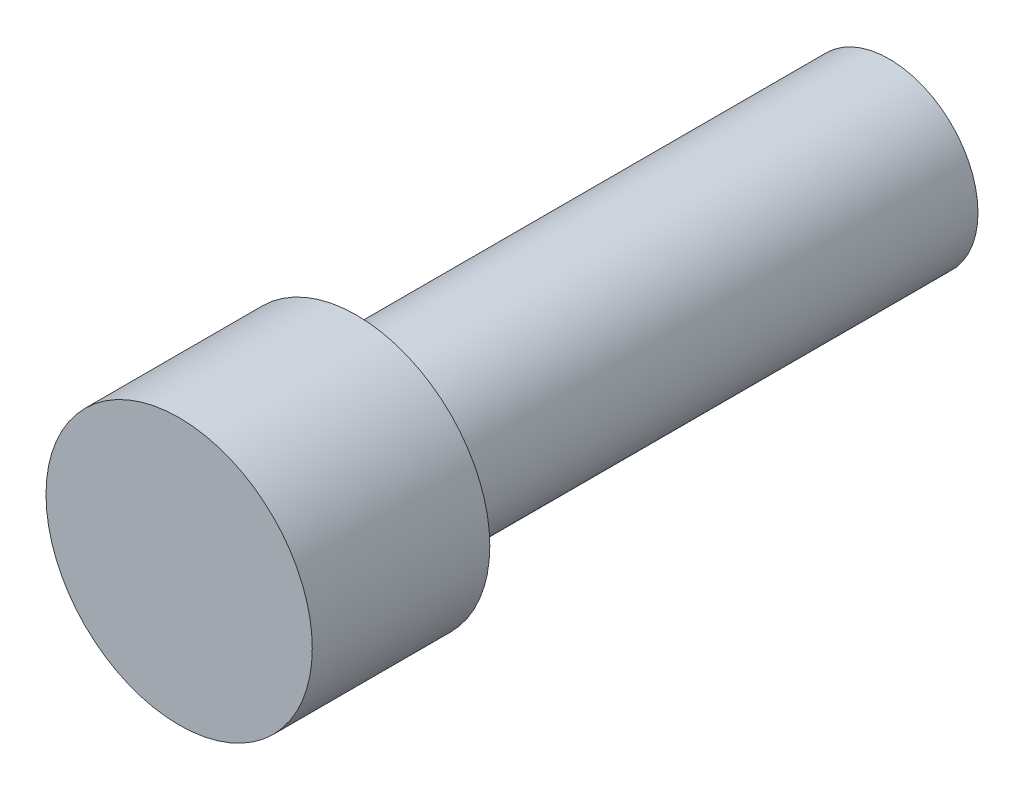
ISO-10303-21;
HEADER;
FILE_DESCRIPTION(('STEP AP214'),'2;1');
FILE_NAME('part.step','',(''),(''),'','','');
FILE_SCHEMA(('AUTOMOTIVE_DESIGN { 1 0 10303 214 1 1 1 1 }'));
ENDSEC;
DATA;
#1=APPLICATION_CONTEXT('core data for automotive mechanical design processes');
#2=APPLICATION_PROTOCOL_DEFINITION('international standard','automotive_design',2000,#1);
#3=PRODUCT_CONTEXT('',#1,'mechanical');
#4=PRODUCT('Part','Part','',(#3));
#5=PRODUCT_RELATED_PRODUCT_CATEGORY('part','',(#4));
#6=PRODUCT_DEFINITION_FORMATION('','',#4);
#7=PRODUCT_DEFINITION_CONTEXT('part definition',#1,'design');
#8=PRODUCT_DEFINITION('design','',#6,#7);
#9=PRODUCT_DEFINITION_SHAPE('','',#8);
#10=(LENGTH_UNIT() NAMED_UNIT(*) SI_UNIT(.MILLI.,.METRE.));
#11=(NAMED_UNIT(*) PLANE_ANGLE_UNIT() SI_UNIT($,.RADIAN.));
#12=(NAMED_UNIT(*) SI_UNIT($,.STERADIAN.) SOLID_ANGLE_UNIT());
#13=UNCERTAINTY_MEASURE_WITH_UNIT(LENGTH_MEASURE(1.E-05),#10,'distance_accuracy_value','');
#14=(GEOMETRIC_REPRESENTATION_CONTEXT(3) GLOBAL_UNCERTAINTY_ASSIGNED_CONTEXT((#13)) GLOBAL_UNIT_ASSIGNED_CONTEXT((#10,
#11,#12)) REPRESENTATION_CONTEXT('',''));
#15=CARTESIAN_POINT('',(0.,0.,0.));
#16=DIRECTION('',(0.,0.,1.));
#17=DIRECTION('',(1.,0.,0.));
#18=AXIS2_PLACEMENT_3D('',#15,#16,#17);
#19=CARTESIAN_POINT('',(0.,0.,30.));
#20=DIRECTION('',(0.,0.,-1.));
#21=DIRECTION('',(-1.,0.,0.));
#22=AXIS2_PLACEMENT_3D('',#19,#20,#21);
#23=CYLINDRICAL_SURFACE('',#22,5.);
#24=CARTESIAN_POINT('',(0.,0.,30.));
#25=DIRECTION('',(0.,0.,1.));
#26=DIRECTION('',(1.,0.,0.));
#27=AXIS2_PLACEMENT_3D('',#24,#25,#26);
#28=CIRCLE('',#27,5.);
#29=CARTESIAN_POINT('',(5.,0.,30.));
#30=VERTEX_POINT('',#29);
#31=EDGE_CURVE('E10',#30,#30,#28,.T.);
#32=ORIENTED_EDGE('',*,*,#31,.F.);
#33=EDGE_LOOP('',(#32));
#34=FACE_BOUND('',#33,.T.);
#35=CARTESIAN_POINT('',(0.,0.,0.));
#36=DIRECTION('',(0.,0.,1.));
#37=DIRECTION('',(1.,0.,0.));
#38=AXIS2_PLACEMENT_3D('',#35,#36,#37);
#39=CIRCLE('',#38,5.);
#40=CARTESIAN_POINT('',(5.,0.,0.));
#41=VERTEX_POINT('',#40);
#42=EDGE_CURVE('E44',#41,#41,#39,.T.);
#43=ORIENTED_EDGE('',*,*,#42,.T.);
#44=EDGE_LOOP('',(#43));
#45=FACE_BOUND('',#44,.T.);
#46=ADVANCED_FACE('F41',(#34,#45),#23,.T.);
#47=CARTESIAN_POINT('',(0.,0.,0.));
#48=DIRECTION('',(0.,0.,1.));
#49=DIRECTION('',(1.,0.,0.));
#50=AXIS2_PLACEMENT_3D('',#47,#48,#49);
#51=PLANE('',#50);
#52=ORIENTED_EDGE('',*,*,#42,.F.);
#53=EDGE_LOOP('',(#52));
#54=FACE_BOUND('',#53,.T.);
#55=ADVANCED_FACE('F68',(#54),#51,.F.);
#56=CARTESIAN_POINT('',(0.,0.,40.));
#57=DIRECTION('',(0.,0.,-1.));
#58=DIRECTION('',(-1.,0.,0.));
#59=AXIS2_PLACEMENT_3D('',#56,#57,#58);
#60=CYLINDRICAL_SURFACE('',#59,7.5);
#61=CARTESIAN_POINT('',(0.,0.,40.));
#62=DIRECTION('',(0.,0.,1.));
#63=DIRECTION('',(1.,0.,0.));
#64=AXIS2_PLACEMENT_3D('',#61,#62,#63);
#65=CIRCLE('',#64,7.5);
#66=CARTESIAN_POINT('',(7.5,0.,40.));
#67=VERTEX_POINT('',#66);
#68=EDGE_CURVE('E53',#67,#67,#65,.T.);
#69=ORIENTED_EDGE('',*,*,#68,.F.);
#70=EDGE_LOOP('',(#69));
#71=FACE_BOUND('',#70,.T.);
#72=CARTESIAN_POINT('',(0.,0.,30.));
#73=DIRECTION('',(0.,0.,1.));
#74=DIRECTION('',(1.,0.,0.));
#75=AXIS2_PLACEMENT_3D('',#72,#73,#74);
#76=CIRCLE('',#75,7.5);
#77=CARTESIAN_POINT('',(7.5,0.,30.));
#78=VERTEX_POINT('',#77);
#79=EDGE_CURVE('E55',#78,#78,#76,.T.);
#80=ORIENTED_EDGE('',*,*,#79,.T.);
#81=EDGE_LOOP('',(#80));
#82=FACE_BOUND('',#81,.T.);
#83=ADVANCED_FACE('F65',(#71,#82),#60,.T.);
#84=CARTESIAN_POINT('',(0.,0.,40.));
#85=DIRECTION('',(0.,0.,1.));
#86=DIRECTION('',(1.,0.,0.));
#87=AXIS2_PLACEMENT_3D('',#84,#85,#86);
#88=PLANE('',#87);
#89=ORIENTED_EDGE('',*,*,#68,.T.);
#90=EDGE_LOOP('',(#89));
#91=FACE_BOUND('',#90,.T.);
#92=ADVANCED_FACE('F63',(#91),#88,.T.);
#93=CARTESIAN_POINT('',(0.,0.,30.));
#94=DIRECTION('',(0.,0.,1.));
#95=DIRECTION('',(1.,0.,0.));
#96=AXIS2_PLACEMENT_3D('',#93,#94,#95);
#97=PLANE('',#96);
#98=ORIENTED_EDGE('',*,*,#31,.T.);
#99=EDGE_LOOP('',(#98));
#100=FACE_BOUND('',#99,.T.);
#101=ORIENTED_EDGE('',*,*,#79,.F.);
#102=EDGE_LOOP('',(#101));
#103=FACE_BOUND('',#102,.T.);
#104=ADVANCED_FACE('F72',(#100,#103),#97,.F.);
#105=CLOSED_SHELL('',(#46,#55,#83,#92,#104));
#106=MANIFOLD_SOLID_BREP('B2',#105);
#107=ADVANCED_BREP_SHAPE_REPRESENTATION('',(#18,#106),#14);
#108=SHAPE_DEFINITION_REPRESENTATION(#9,#107);
ENDSEC;
END-ISO-10303-21;
